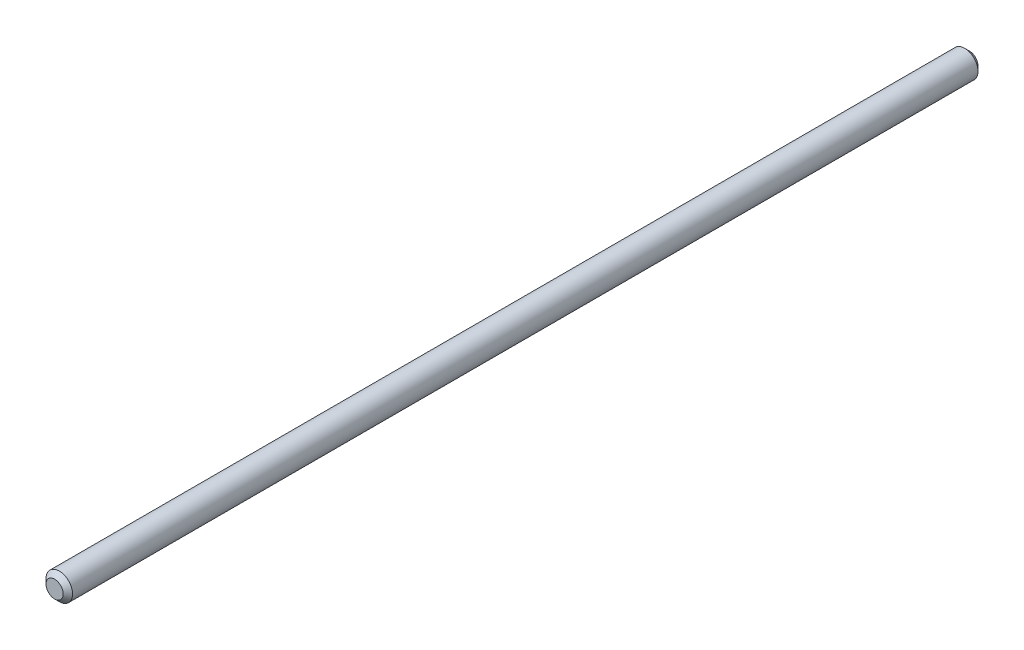
ISO-10303-21;
HEADER;
FILE_DESCRIPTION(('STEP AP214'),'2;1');
FILE_NAME('part.step','',(''),(''),'','','');
FILE_SCHEMA(('AUTOMOTIVE_DESIGN { 1 0 10303 214 1 1 1 1 }'));
ENDSEC;
DATA;
#1=APPLICATION_CONTEXT('core data for automotive mechanical design processes');
#2=APPLICATION_PROTOCOL_DEFINITION('international standard','automotive_design',2000,#1);
#3=PRODUCT_CONTEXT('',#1,'mechanical');
#4=PRODUCT('Part','Part','',(#3));
#5=PRODUCT_RELATED_PRODUCT_CATEGORY('part','',(#4));
#6=PRODUCT_DEFINITION_FORMATION('','',#4);
#7=PRODUCT_DEFINITION_CONTEXT('part definition',#1,'design');
#8=PRODUCT_DEFINITION('design','',#6,#7);
#9=PRODUCT_DEFINITION_SHAPE('','',#8);
#10=(LENGTH_UNIT() NAMED_UNIT(*) SI_UNIT(.MILLI.,.METRE.));
#11=(NAMED_UNIT(*) PLANE_ANGLE_UNIT() SI_UNIT($,.RADIAN.));
#12=(NAMED_UNIT(*) SI_UNIT($,.STERADIAN.) SOLID_ANGLE_UNIT());
#13=UNCERTAINTY_MEASURE_WITH_UNIT(LENGTH_MEASURE(1.E-05),#10,'distance_accuracy_value','');
#14=(GEOMETRIC_REPRESENTATION_CONTEXT(3) GLOBAL_UNCERTAINTY_ASSIGNED_CONTEXT((#13)) GLOBAL_UNIT_ASSIGNED_CONTEXT((#10,
#11,#12)) REPRESENTATION_CONTEXT('',''));
#15=CARTESIAN_POINT('',(0.,0.,0.));
#16=DIRECTION('',(0.,0.,1.));
#17=DIRECTION('',(1.,0.,0.));
#18=AXIS2_PLACEMENT_3D('',#15,#16,#17);
#19=CARTESIAN_POINT('',(0.,0.,49.));
#20=DIRECTION('',(0.,0.,-1.));
#21=DIRECTION('',(-1.,0.,0.));
#22=AXIS2_PLACEMENT_3D('',#19,#20,#21);
#23=PLANE('',#22);
#24=CARTESIAN_POINT('',(0.,0.,49.));
#25=DIRECTION('',(0.,0.,-1.));
#26=DIRECTION('',(-1.,0.,0.));
#27=AXIS2_PLACEMENT_3D('',#24,#25,#26);
#28=CIRCLE('',#27,0.9224);
#29=CARTESIAN_POINT('',(0.9224,0.,49.));
#30=VERTEX_POINT('',#29);
#31=EDGE_CURVE('E10',#30,#30,#28,.T.);
#32=ORIENTED_EDGE('',*,*,#31,.F.);
#33=EDGE_LOOP('',(#32));
#34=FACE_BOUND('',#33,.T.);
#35=ADVANCED_FACE('F15',(#34),#23,.F.);
#36=CARTESIAN_POINT('',(0.,0.,48.75));
#37=DIRECTION('',(0.,0.,-1.));
#38=DIRECTION('',(-1.,0.,0.));
#39=AXIS2_PLACEMENT_3D('',#36,#37,#38);
#40=CONICAL_SURFACE('',#39,1.1724,0.78539816339745);
#41=CARTESIAN_POINT('',(0.,0.,48.5));
#42=DIRECTION('',(0.,0.,1.));
#43=DIRECTION('',(-1.,0.,0.));
#44=AXIS2_PLACEMENT_3D('',#41,#42,#43);
#45=CIRCLE('',#44,1.4224);
#46=CARTESIAN_POINT('',(1.4224,0.,48.5));
#47=VERTEX_POINT('',#46);
#48=EDGE_CURVE('E25',#47,#47,#45,.T.);
#49=ORIENTED_EDGE('',*,*,#48,.T.);
#50=EDGE_LOOP('',(#49));
#51=FACE_BOUND('',#50,.T.);
#52=ORIENTED_EDGE('',*,*,#31,.T.);
#53=EDGE_LOOP('',(#52));
#54=FACE_BOUND('',#53,.T.);
#55=ADVANCED_FACE('F46',(#51,#54),#40,.T.);
#56=CARTESIAN_POINT('',(0.,0.,-49.));
#57=DIRECTION('',(0.,0.,-1.));
#58=DIRECTION('',(-1.,0.,0.));
#59=AXIS2_PLACEMENT_3D('',#56,#57,#58);
#60=PLANE('',#59);
#61=CARTESIAN_POINT('',(0.,0.,-49.));
#62=DIRECTION('',(0.,0.,1.));
#63=DIRECTION('',(-1.,0.,0.));
#64=AXIS2_PLACEMENT_3D('',#61,#62,#63);
#65=CIRCLE('',#64,0.9224);
#66=CARTESIAN_POINT('',(0.9224,0.,-49.));
#67=VERTEX_POINT('',#66);
#68=EDGE_CURVE('E37',#67,#67,#65,.T.);
#69=ORIENTED_EDGE('',*,*,#68,.F.);
#70=EDGE_LOOP('',(#69));
#71=FACE_BOUND('',#70,.T.);
#72=ADVANCED_FACE('F17',(#71),#60,.T.);
#73=CARTESIAN_POINT('',(0.,0.,0.));
#74=DIRECTION('',(0.,0.,-1.));
#75=DIRECTION('',(-1.,0.,0.));
#76=AXIS2_PLACEMENT_3D('',#73,#74,#75);
#77=CYLINDRICAL_SURFACE('',#76,1.4224);
#78=CARTESIAN_POINT('',(0.,0.,-48.5));
#79=DIRECTION('',(0.,0.,-1.));
#80=DIRECTION('',(-1.,0.,0.));
#81=AXIS2_PLACEMENT_3D('',#78,#79,#80);
#82=CIRCLE('',#81,1.4224);
#83=CARTESIAN_POINT('',(1.4224,0.,-48.5));
#84=VERTEX_POINT('',#83);
#85=EDGE_CURVE('E19',#84,#84,#82,.T.);
#86=ORIENTED_EDGE('',*,*,#85,.F.);
#87=EDGE_LOOP('',(#86));
#88=FACE_BOUND('',#87,.T.);
#89=ORIENTED_EDGE('',*,*,#48,.F.);
#90=EDGE_LOOP('',(#89));
#91=FACE_BOUND('',#90,.T.);
#92=ADVANCED_FACE('F48',(#88,#91),#77,.T.);
#93=CARTESIAN_POINT('',(0.,0.,-48.75));
#94=DIRECTION('',(0.,0.,1.));
#95=DIRECTION('',(-1.,0.,0.));
#96=AXIS2_PLACEMENT_3D('',#93,#94,#95);
#97=CONICAL_SURFACE('',#96,1.1724,0.78539816339745);
#98=ORIENTED_EDGE('',*,*,#85,.T.);
#99=EDGE_LOOP('',(#98));
#100=FACE_BOUND('',#99,.T.);
#101=ORIENTED_EDGE('',*,*,#68,.T.);
#102=EDGE_LOOP('',(#101));
#103=FACE_BOUND('',#102,.T.);
#104=ADVANCED_FACE('F41',(#100,#103),#97,.T.);
#105=CLOSED_SHELL('',(#35,#55,#72,#92,#104));
#106=MANIFOLD_SOLID_BREP('B1',#105);
#107=ADVANCED_BREP_SHAPE_REPRESENTATION('',(#18,#106),#14);
#108=SHAPE_DEFINITION_REPRESENTATION(#9,#107);
ENDSEC;
END-ISO-10303-21;
